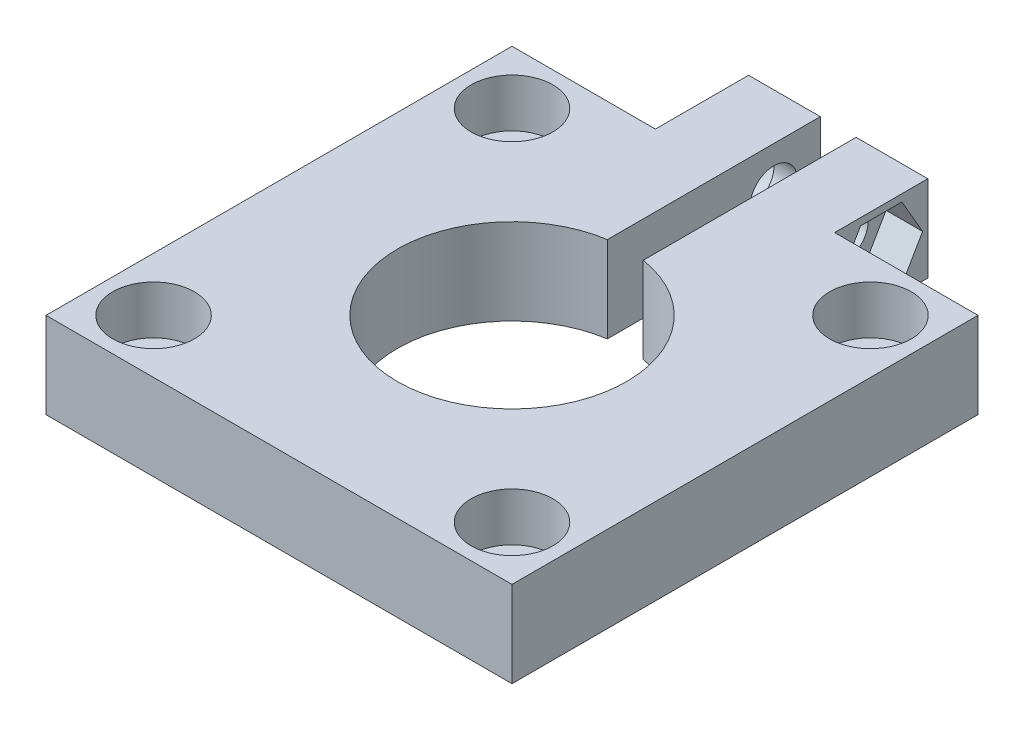
ISO-10303-21;
HEADER;
FILE_DESCRIPTION(('STEP AP214'),'2;1');
FILE_NAME('part.step','',(''),(''),'','','');
FILE_SCHEMA(('AUTOMOTIVE_DESIGN { 1 0 10303 214 1 1 1 1 }'));
ENDSEC;
DATA;
#1=APPLICATION_CONTEXT('core data for automotive mechanical design processes');
#2=APPLICATION_PROTOCOL_DEFINITION('international standard','automotive_design',2000,#1);
#3=PRODUCT_CONTEXT('',#1,'mechanical');
#4=PRODUCT('Part','Part','',(#3));
#5=PRODUCT_RELATED_PRODUCT_CATEGORY('part','',(#4));
#6=PRODUCT_DEFINITION_FORMATION('','',#4);
#7=PRODUCT_DEFINITION_CONTEXT('part definition',#1,'design');
#8=PRODUCT_DEFINITION('design','',#6,#7);
#9=PRODUCT_DEFINITION_SHAPE('','',#8);
#10=(LENGTH_UNIT() NAMED_UNIT(*) SI_UNIT(.MILLI.,.METRE.));
#11=(NAMED_UNIT(*) PLANE_ANGLE_UNIT() SI_UNIT($,.RADIAN.));
#12=(NAMED_UNIT(*) SI_UNIT($,.STERADIAN.) SOLID_ANGLE_UNIT());
#13=UNCERTAINTY_MEASURE_WITH_UNIT(LENGTH_MEASURE(1.E-05),#10,'distance_accuracy_value','');
#14=(GEOMETRIC_REPRESENTATION_CONTEXT(3) GLOBAL_UNCERTAINTY_ASSIGNED_CONTEXT((#13)) GLOBAL_UNIT_ASSIGNED_CONTEXT((#10,
#11,#12)) REPRESENTATION_CONTEXT('',''));
#15=CARTESIAN_POINT('',(0.,0.,0.));
#16=DIRECTION('',(0.,0.,1.));
#17=DIRECTION('',(1.,0.,0.));
#18=AXIS2_PLACEMENT_3D('',#15,#16,#17);
#19=CARTESIAN_POINT('',(-12.5,6.,-39.));
#20=DIRECTION('',(-1.,0.,0.));
#21=DIRECTION('',(0.,0.,1.));
#22=AXIS2_PLACEMENT_3D('',#19,#20,#21);
#23=CYLINDRICAL_SURFACE('',#22,3.3);
#24=CARTESIAN_POINT('',(2.5,6.,-39.));
#25=DIRECTION('',(1.,0.,0.));
#26=DIRECTION('',(0.,0.,-1.));
#27=AXIS2_PLACEMENT_3D('',#24,#25,#26);
#28=CIRCLE('',#27,3.3);
#29=CARTESIAN_POINT('',(2.5,6.,-42.3));
#30=VERTEX_POINT('',#29);
#31=EDGE_CURVE('E226',#30,#30,#28,.T.);
#32=ORIENTED_EDGE('',*,*,#31,.F.);
#33=EDGE_LOOP('',(#32));
#34=FACE_BOUND('',#33,.T.);
#35=CARTESIAN_POINT('',(7.4,6.,-39.));
#36=DIRECTION('',(1.,0.,0.));
#37=DIRECTION('',(0.,0.,-1.));
#38=AXIS2_PLACEMENT_3D('',#35,#36,#37);
#39=CIRCLE('',#38,3.3);
#40=CARTESIAN_POINT('',(7.4,6.,-42.3));
#41=VERTEX_POINT('',#40);
#42=EDGE_CURVE('E37',#41,#41,#39,.F.);
#43=ORIENTED_EDGE('',*,*,#42,.F.);
#44=EDGE_LOOP('',(#43));
#45=FACE_BOUND('',#44,.T.);
#46=ADVANCED_FACE('F33',(#34,#45),#23,.F.);
#47=CARTESIAN_POINT('',(-32.5,12.,-32.5));
#48=DIRECTION('',(0.,0.,1.));
#49=DIRECTION('',(1.,0.,0.));
#50=AXIS2_PLACEMENT_3D('',#47,#48,#49);
#51=PLANE('',#50);
#52=DIRECTION('',(-1.,0.,0.));
#53=VECTOR('',#52,1.);
#54=CARTESIAN_POINT('',(-32.5,0.,-32.5));
#55=LINE('',#54,#53);
#56=CARTESIAN_POINT('',(32.5,0.,-32.5));
#57=VERTEX_POINT('',#56);
#58=CARTESIAN_POINT('',(12.5,0.,-32.5));
#59=VERTEX_POINT('',#58);
#60=EDGE_CURVE('E301',#57,#59,#55,.T.);
#61=ORIENTED_EDGE('',*,*,#60,.T.);
#62=DIRECTION('',(0.,1.,0.));
#63=VECTOR('',#62,1.);
#64=CARTESIAN_POINT('',(12.5,0.,-32.5));
#65=LINE('',#64,#63);
#66=CARTESIAN_POINT('',(12.5,12.,-32.5));
#67=VERTEX_POINT('',#66);
#68=EDGE_CURVE('E57',#59,#67,#65,.T.);
#69=ORIENTED_EDGE('',*,*,#68,.T.);
#70=DIRECTION('',(-1.,0.,0.));
#71=VECTOR('',#70,1.);
#72=CARTESIAN_POINT('',(-32.5,12.,-32.5));
#73=LINE('',#72,#71);
#74=CARTESIAN_POINT('',(32.5,12.,-32.5));
#75=VERTEX_POINT('',#74);
#76=EDGE_CURVE('E291',#75,#67,#73,.T.);
#77=ORIENTED_EDGE('',*,*,#76,.F.);
#78=DIRECTION('',(0.,-1.,0.));
#79=VECTOR('',#78,1.);
#80=CARTESIAN_POINT('',(32.5,12.,-32.5));
#81=LINE('',#80,#79);
#82=EDGE_CURVE('E314',#75,#57,#81,.T.);
#83=ORIENTED_EDGE('',*,*,#82,.T.);
#84=EDGE_LOOP('',(#61,#69,#77,#83));
#85=FACE_BOUND('',#84,.T.);
#86=ADVANCED_FACE('F341',(#85),#51,.F.);
#87=CARTESIAN_POINT('',(32.5,12.,-32.5));
#88=DIRECTION('',(-1.,0.,0.));
#89=DIRECTION('',(0.,0.,1.));
#90=AXIS2_PLACEMENT_3D('',#87,#88,#89);
#91=PLANE('',#90);
#92=DIRECTION('',(0.,0.,-1.));
#93=VECTOR('',#92,1.);
#94=CARTESIAN_POINT('',(32.5,0.,-32.5));
#95=LINE('',#94,#93);
#96=CARTESIAN_POINT('',(32.5,0.,32.5));
#97=VERTEX_POINT('',#96);
#98=EDGE_CURVE('E283',#97,#57,#95,.T.);
#99=ORIENTED_EDGE('',*,*,#98,.T.);
#100=ORIENTED_EDGE('',*,*,#82,.F.);
#101=DIRECTION('',(0.,0.,-1.));
#102=VECTOR('',#101,1.);
#103=CARTESIAN_POINT('',(32.5,12.,-32.5));
#104=LINE('',#103,#102);
#105=CARTESIAN_POINT('',(32.5,12.,32.5));
#106=VERTEX_POINT('',#105);
#107=EDGE_CURVE('E286',#106,#75,#104,.T.);
#108=ORIENTED_EDGE('',*,*,#107,.F.);
#109=DIRECTION('',(0.,-1.,0.));
#110=VECTOR('',#109,1.);
#111=CARTESIAN_POINT('',(32.5,12.,32.5));
#112=LINE('',#111,#110);
#113=EDGE_CURVE('E297',#106,#97,#112,.T.);
#114=ORIENTED_EDGE('',*,*,#113,.T.);
#115=EDGE_LOOP('',(#99,#100,#108,#114));
#116=FACE_BOUND('',#115,.T.);
#117=ADVANCED_FACE('F35',(#116),#91,.F.);
#118=CARTESIAN_POINT('',(-12.5,12.,-32.5));
#119=VERTEX_POINT('',#118);
#120=CARTESIAN_POINT('',(-32.5,12.,-32.5));
#121=VERTEX_POINT('',#120);
#122=EDGE_CURVE('E289',#119,#121,#73,.T.);
#123=ORIENTED_EDGE('',*,*,#122,.F.);
#124=DIRECTION('',(0.,1.,0.));
#125=VECTOR('',#124,1.);
#126=CARTESIAN_POINT('',(-12.5,0.,-32.5));
#127=LINE('',#126,#125);
#128=CARTESIAN_POINT('',(-12.5,0.,-32.5));
#129=VERTEX_POINT('',#128);
#130=EDGE_CURVE('E263',#129,#119,#127,.T.);
#131=ORIENTED_EDGE('',*,*,#130,.F.);
#132=CARTESIAN_POINT('',(-32.5,0.,-32.5));
#133=VERTEX_POINT('',#132);
#134=EDGE_CURVE('E300',#129,#133,#55,.T.);
#135=ORIENTED_EDGE('',*,*,#134,.T.);
#136=DIRECTION('',(0.,-1.,0.));
#137=VECTOR('',#136,1.);
#138=CARTESIAN_POINT('',(-32.5,12.,-32.5));
#139=LINE('',#138,#137);
#140=EDGE_CURVE('E311',#121,#133,#139,.T.);
#141=ORIENTED_EDGE('',*,*,#140,.F.);
#142=EDGE_LOOP('',(#123,#131,#135,#141));
#143=FACE_BOUND('',#142,.T.);
#144=ADVANCED_FACE('F357',(#143),#51,.F.);
#145=CARTESIAN_POINT('',(-32.5,12.,-32.5));
#146=DIRECTION('',(1.,0.,0.));
#147=DIRECTION('',(0.,0.,-1.));
#148=AXIS2_PLACEMENT_3D('',#145,#146,#147);
#149=PLANE('',#148);
#150=DIRECTION('',(0.,0.,1.));
#151=VECTOR('',#150,1.);
#152=CARTESIAN_POINT('',(-32.5,0.,-32.5));
#153=LINE('',#152,#151);
#154=CARTESIAN_POINT('',(-32.5,0.,32.5));
#155=VERTEX_POINT('',#154);
#156=EDGE_CURVE('E303',#133,#155,#153,.T.);
#157=ORIENTED_EDGE('',*,*,#156,.T.);
#158=DIRECTION('',(0.,-1.,0.));
#159=VECTOR('',#158,1.);
#160=CARTESIAN_POINT('',(-32.5,12.,32.5));
#161=LINE('',#160,#159);
#162=CARTESIAN_POINT('',(-32.5,12.,32.5));
#163=VERTEX_POINT('',#162);
#164=EDGE_CURVE('E308',#163,#155,#161,.T.);
#165=ORIENTED_EDGE('',*,*,#164,.F.);
#166=DIRECTION('',(0.,0.,1.));
#167=VECTOR('',#166,1.);
#168=CARTESIAN_POINT('',(-32.5,12.,-32.5));
#169=LINE('',#168,#167);
#170=EDGE_CURVE('E293',#121,#163,#169,.T.);
#171=ORIENTED_EDGE('',*,*,#170,.F.);
#172=ORIENTED_EDGE('',*,*,#140,.T.);
#173=EDGE_LOOP('',(#157,#165,#171,#172));
#174=FACE_BOUND('',#173,.T.);
#175=ADVANCED_FACE('F354',(#174),#149,.F.);
#176=CARTESIAN_POINT('',(-32.5,12.,32.5));
#177=DIRECTION('',(0.,0.,-1.));
#178=DIRECTION('',(-1.,0.,0.));
#179=AXIS2_PLACEMENT_3D('',#176,#177,#178);
#180=PLANE('',#179);
#181=DIRECTION('',(1.,0.,0.));
#182=VECTOR('',#181,1.);
#183=CARTESIAN_POINT('',(-32.5,0.,32.5));
#184=LINE('',#183,#182);
#185=EDGE_CURVE('E290',#155,#97,#184,.T.);
#186=ORIENTED_EDGE('',*,*,#185,.T.);
#187=ORIENTED_EDGE('',*,*,#113,.F.);
#188=DIRECTION('',(1.,0.,0.));
#189=VECTOR('',#188,1.);
#190=CARTESIAN_POINT('',(-32.5,12.,32.5));
#191=LINE('',#190,#189);
#192=EDGE_CURVE('E295',#163,#106,#191,.T.);
#193=ORIENTED_EDGE('',*,*,#192,.F.);
#194=ORIENTED_EDGE('',*,*,#164,.T.);
#195=EDGE_LOOP('',(#186,#187,#193,#194));
#196=FACE_BOUND('',#195,.T.);
#197=ADVANCED_FACE('F349',(#196),#180,.F.);
#198=CARTESIAN_POINT('',(32.5,12.,32.5));
#199=DIRECTION('',(0.,1.,0.));
#200=DIRECTION('',(0.,0.,1.));
#201=AXIS2_PLACEMENT_3D('',#198,#199,#200);
#202=PLANE('',#201);
#203=CARTESIAN_POINT('',(-25.,12.,25.));
#204=DIRECTION('',(0.,1.,0.));
#205=DIRECTION('',(0.,0.,1.));
#206=AXIS2_PLACEMENT_3D('',#203,#204,#205);
#207=CIRCLE('',#206,5.7);
#208=CARTESIAN_POINT('',(-25.,12.,30.7));
#209=VERTEX_POINT('',#208);
#210=EDGE_CURVE('E511',#209,#209,#207,.T.);
#211=ORIENTED_EDGE('',*,*,#210,.F.);
#212=EDGE_LOOP('',(#211));
#213=FACE_BOUND('',#212,.T.);
#214=CARTESIAN_POINT('',(25.,12.,25.));
#215=DIRECTION('',(0.,1.,0.));
#216=DIRECTION('',(0.,0.,1.));
#217=AXIS2_PLACEMENT_3D('',#214,#215,#216);
#218=CIRCLE('',#217,5.7);
#219=CARTESIAN_POINT('',(25.,12.,30.7));
#220=VERTEX_POINT('',#219);
#221=EDGE_CURVE('E522',#220,#220,#218,.T.);
#222=ORIENTED_EDGE('',*,*,#221,.F.);
#223=EDGE_LOOP('',(#222));
#224=FACE_BOUND('',#223,.T.);
#225=CARTESIAN_POINT('',(25.,12.,-25.));
#226=DIRECTION('',(0.,1.,0.));
#227=DIRECTION('',(0.,0.,1.));
#228=AXIS2_PLACEMENT_3D('',#225,#226,#227);
#229=CIRCLE('',#228,5.7);
#230=CARTESIAN_POINT('',(25.,12.,-19.3));
#231=VERTEX_POINT('',#230);
#232=EDGE_CURVE('E534',#231,#231,#229,.T.);
#233=ORIENTED_EDGE('',*,*,#232,.F.);
#234=EDGE_LOOP('',(#233));
#235=FACE_BOUND('',#234,.T.);
#236=CARTESIAN_POINT('',(-25.,12.,-25.));
#237=DIRECTION('',(0.,1.,0.));
#238=DIRECTION('',(0.,0.,1.));
#239=AXIS2_PLACEMENT_3D('',#236,#237,#238);
#240=CIRCLE('',#239,5.7);
#241=CARTESIAN_POINT('',(-25.,12.,-19.3));
#242=VERTEX_POINT('',#241);
#243=EDGE_CURVE('E546',#242,#242,#240,.T.);
#244=ORIENTED_EDGE('',*,*,#243,.F.);
#245=EDGE_LOOP('',(#244));
#246=FACE_BOUND('',#245,.T.);
#247=DIRECTION('',(0.,0.,-1.));
#248=VECTOR('',#247,1.);
#249=CARTESIAN_POINT('',(2.5,12.,-52.5));
#250=LINE('',#249,#248);
#251=CARTESIAN_POINT('',(2.5,12.,-15.8034806292791));
#252=VERTEX_POINT('',#251);
#253=CARTESIAN_POINT('',(2.5,12.,-45.5));
#254=VERTEX_POINT('',#253);
#255=EDGE_CURVE('E266',#252,#254,#250,.T.);
#256=ORIENTED_EDGE('',*,*,#255,.F.);
#257=CARTESIAN_POINT('',(0.,12.,0.));
#258=DIRECTION('',(0.,1.,0.));
#259=DIRECTION('',(0.,0.,1.));
#260=AXIS2_PLACEMENT_3D('',#257,#258,#259);
#261=CIRCLE('',#260,16.);
#262=CARTESIAN_POINT('',(-2.5,12.,-15.8034806292791));
#263=VERTEX_POINT('',#262);
#264=EDGE_CURVE('E277',#263,#252,#261,.T.);
#265=ORIENTED_EDGE('',*,*,#264,.F.);
#266=DIRECTION('',(0.,0.,1.));
#267=VECTOR('',#266,1.);
#268=CARTESIAN_POINT('',(-2.5,12.,-52.5));
#269=LINE('',#268,#267);
#270=CARTESIAN_POINT('',(-2.5,12.,-45.5));
#271=VERTEX_POINT('',#270);
#272=EDGE_CURVE('E274',#271,#263,#269,.T.);
#273=ORIENTED_EDGE('',*,*,#272,.F.);
#274=DIRECTION('',(-1.,0.,0.));
#275=VECTOR('',#274,1.);
#276=CARTESIAN_POINT('',(-2.5,12.,-45.5));
#277=LINE('',#276,#275);
#278=CARTESIAN_POINT('',(-12.5,12.,-45.5));
#279=VERTEX_POINT('',#278);
#280=EDGE_CURVE('E246',#271,#279,#277,.T.);
#281=ORIENTED_EDGE('',*,*,#280,.T.);
#282=DIRECTION('',(0.,0.,1.));
#283=VECTOR('',#282,1.);
#284=CARTESIAN_POINT('',(-12.5,12.,-32.5));
#285=LINE('',#284,#283);
#286=EDGE_CURVE('E255',#279,#119,#285,.T.);
#287=ORIENTED_EDGE('',*,*,#286,.T.);
#288=ORIENTED_EDGE('',*,*,#122,.T.);
#289=ORIENTED_EDGE('',*,*,#170,.T.);
#290=ORIENTED_EDGE('',*,*,#192,.T.);
#291=ORIENTED_EDGE('',*,*,#107,.T.);
#292=ORIENTED_EDGE('',*,*,#76,.T.);
#293=DIRECTION('',(0.,0.,-1.));
#294=VECTOR('',#293,1.);
#295=CARTESIAN_POINT('',(12.5,12.,-32.5));
#296=LINE('',#295,#294);
#297=CARTESIAN_POINT('',(12.5,12.,-45.5));
#298=VERTEX_POINT('',#297);
#299=EDGE_CURVE('E232',#67,#298,#296,.T.);
#300=ORIENTED_EDGE('',*,*,#299,.T.);
#301=DIRECTION('',(-1.,0.,0.));
#302=VECTOR('',#301,1.);
#303=CARTESIAN_POINT('',(12.5,12.,-45.5));
#304=LINE('',#303,#302);
#305=EDGE_CURVE('E237',#298,#254,#304,.T.);
#306=ORIENTED_EDGE('',*,*,#305,.T.);
#307=EDGE_LOOP('',(#256,#265,#273,#281,#287,#288,#289,#290,#291,#292,#300,#306));
#308=FACE_BOUND('',#307,.T.);
#309=ADVANCED_FACE('F325',(#213,#224,#235,#246,#308),#202,.T.);
#310=CARTESIAN_POINT('',(32.5,0.,32.5));
#311=DIRECTION('',(0.,1.,0.));
#312=DIRECTION('',(0.,0.,1.));
#313=AXIS2_PLACEMENT_3D('',#310,#311,#312);
#314=PLANE('',#313);
#315=CARTESIAN_POINT('',(-25.,0.,25.));
#316=DIRECTION('',(0.,1.,0.));
#317=DIRECTION('',(0.,0.,1.));
#318=AXIS2_PLACEMENT_3D('',#315,#316,#317);
#319=CIRCLE('',#318,3.75);
#320=CARTESIAN_POINT('',(-25.,0.,28.75));
#321=VERTEX_POINT('',#320);
#322=EDGE_CURVE('E519',#321,#321,#319,.T.);
#323=ORIENTED_EDGE('',*,*,#322,.T.);
#324=EDGE_LOOP('',(#323));
#325=FACE_BOUND('',#324,.T.);
#326=CARTESIAN_POINT('',(25.,0.,25.));
#327=DIRECTION('',(0.,1.,0.));
#328=DIRECTION('',(0.,0.,1.));
#329=AXIS2_PLACEMENT_3D('',#326,#327,#328);
#330=CIRCLE('',#329,3.75);
#331=CARTESIAN_POINT('',(25.,0.,28.75));
#332=VERTEX_POINT('',#331);
#333=EDGE_CURVE('E531',#332,#332,#330,.T.);
#334=ORIENTED_EDGE('',*,*,#333,.T.);
#335=EDGE_LOOP('',(#334));
#336=FACE_BOUND('',#335,.T.);
#337=CARTESIAN_POINT('',(25.,0.,-25.));
#338=DIRECTION('',(0.,1.,0.));
#339=DIRECTION('',(0.,0.,1.));
#340=AXIS2_PLACEMENT_3D('',#337,#338,#339);
#341=CIRCLE('',#340,3.75);
#342=CARTESIAN_POINT('',(25.,0.,-21.25));
#343=VERTEX_POINT('',#342);
#344=EDGE_CURVE('E543',#343,#343,#341,.T.);
#345=ORIENTED_EDGE('',*,*,#344,.T.);
#346=EDGE_LOOP('',(#345));
#347=FACE_BOUND('',#346,.T.);
#348=CARTESIAN_POINT('',(-25.,0.,-25.));
#349=DIRECTION('',(0.,1.,0.));
#350=DIRECTION('',(0.,0.,1.));
#351=AXIS2_PLACEMENT_3D('',#348,#349,#350);
#352=CIRCLE('',#351,3.75);
#353=CARTESIAN_POINT('',(-25.,0.,-21.25));
#354=VERTEX_POINT('',#353);
#355=EDGE_CURVE('E187',#354,#354,#352,.T.);
#356=ORIENTED_EDGE('',*,*,#355,.T.);
#357=EDGE_LOOP('',(#356));
#358=FACE_BOUND('',#357,.T.);
#359=CARTESIAN_POINT('',(0.,0.,0.));
#360=DIRECTION('',(0.,1.,0.));
#361=DIRECTION('',(0.,0.,1.));
#362=AXIS2_PLACEMENT_3D('',#359,#360,#361);
#363=CIRCLE('',#362,16.);
#364=CARTESIAN_POINT('',(-2.5,0.,-15.8034806292791));
#365=VERTEX_POINT('',#364);
#366=CARTESIAN_POINT('',(2.5,0.,-15.8034806292791));
#367=VERTEX_POINT('',#366);
#368=EDGE_CURVE('E280',#365,#367,#363,.T.);
#369=ORIENTED_EDGE('',*,*,#368,.T.);
#370=DIRECTION('',(0.,0.,-1.));
#371=VECTOR('',#370,1.);
#372=CARTESIAN_POINT('',(2.5,0.,-52.5));
#373=LINE('',#372,#371);
#374=CARTESIAN_POINT('',(2.5,0.,-45.5));
#375=VERTEX_POINT('',#374);
#376=EDGE_CURVE('E271',#367,#375,#373,.T.);
#377=ORIENTED_EDGE('',*,*,#376,.T.);
#378=DIRECTION('',(-1.,0.,0.));
#379=VECTOR('',#378,1.);
#380=CARTESIAN_POINT('',(12.5,0.,-45.5));
#381=LINE('',#380,#379);
#382=CARTESIAN_POINT('',(12.5,0.,-45.5));
#383=VERTEX_POINT('',#382);
#384=EDGE_CURVE('E236',#383,#375,#381,.T.);
#385=ORIENTED_EDGE('',*,*,#384,.F.);
#386=DIRECTION('',(0.,0.,-1.));
#387=VECTOR('',#386,1.);
#388=CARTESIAN_POINT('',(12.5,0.,-32.5));
#389=LINE('',#388,#387);
#390=EDGE_CURVE('E233',#59,#383,#389,.T.);
#391=ORIENTED_EDGE('',*,*,#390,.F.);
#392=ORIENTED_EDGE('',*,*,#60,.F.);
#393=ORIENTED_EDGE('',*,*,#98,.F.);
#394=ORIENTED_EDGE('',*,*,#185,.F.);
#395=ORIENTED_EDGE('',*,*,#156,.F.);
#396=ORIENTED_EDGE('',*,*,#134,.F.);
#397=DIRECTION('',(0.,0.,1.));
#398=VECTOR('',#397,1.);
#399=CARTESIAN_POINT('',(-12.5,0.,-32.5));
#400=LINE('',#399,#398);
#401=CARTESIAN_POINT('',(-12.5,0.,-45.5));
#402=VERTEX_POINT('',#401);
#403=EDGE_CURVE('E254',#402,#129,#400,.T.);
#404=ORIENTED_EDGE('',*,*,#403,.F.);
#405=DIRECTION('',(-1.,0.,0.));
#406=VECTOR('',#405,1.);
#407=CARTESIAN_POINT('',(-2.5,0.,-45.5));
#408=LINE('',#407,#406);
#409=CARTESIAN_POINT('',(-2.5,0.,-45.5));
#410=VERTEX_POINT('',#409);
#411=EDGE_CURVE('E251',#410,#402,#408,.T.);
#412=ORIENTED_EDGE('',*,*,#411,.F.);
#413=DIRECTION('',(0.,0.,1.));
#414=VECTOR('',#413,1.);
#415=CARTESIAN_POINT('',(-2.5,0.,-52.5));
#416=LINE('',#415,#414);
#417=EDGE_CURVE('E273',#410,#365,#416,.T.);
#418=ORIENTED_EDGE('',*,*,#417,.T.);
#419=EDGE_LOOP('',(#369,#377,#385,#391,#392,#393,#394,#395,#396,#404,#412,#418));
#420=FACE_BOUND('',#419,.T.);
#421=ADVANCED_FACE('F335',(#325,#336,#347,#358,#420),#314,.F.);
#422=CARTESIAN_POINT('',(0.,0.,0.));
#423=DIRECTION('',(0.,1.,0.));
#424=DIRECTION('',(0.,0.,1.));
#425=AXIS2_PLACEMENT_3D('',#422,#423,#424);
#426=CYLINDRICAL_SURFACE('',#425,16.);
#427=ORIENTED_EDGE('',*,*,#264,.T.);
#428=DIRECTION('',(0.,1.,0.));
#429=VECTOR('',#428,1.);
#430=CARTESIAN_POINT('',(2.5,0.,-15.8034806292791));
#431=LINE('',#430,#429);
#432=EDGE_CURVE('E11',#252,#367,#431,.F.);
#433=ORIENTED_EDGE('',*,*,#432,.T.);
#434=ORIENTED_EDGE('',*,*,#368,.F.);
#435=DIRECTION('',(0.,1.,0.));
#436=VECTOR('',#435,1.);
#437=CARTESIAN_POINT('',(-2.5,0.,-15.8034806292791));
#438=LINE('',#437,#436);
#439=EDGE_CURVE('E42',#365,#263,#438,.T.);
#440=ORIENTED_EDGE('',*,*,#439,.T.);
#441=EDGE_LOOP('',(#427,#433,#434,#440));
#442=FACE_BOUND('',#441,.T.);
#443=ADVANCED_FACE('F321',(#442),#426,.F.);
#444=CARTESIAN_POINT('',(-2.5,0.,-52.5));
#445=DIRECTION('',(-1.,0.,0.));
#446=DIRECTION('',(0.,0.,1.));
#447=AXIS2_PLACEMENT_3D('',#444,#445,#446);
#448=PLANE('',#447);
#449=CARTESIAN_POINT('',(-2.5,6.,-39.));
#450=DIRECTION('',(-1.,0.,0.));
#451=DIRECTION('',(0.,0.,1.));
#452=AXIS2_PLACEMENT_3D('',#449,#450,#451);
#453=CIRCLE('',#452,3.3);
#454=CARTESIAN_POINT('',(-2.5,6.,-35.7));
#455=VERTEX_POINT('',#454);
#456=EDGE_CURVE('E229',#455,#455,#453,.T.);
#457=ORIENTED_EDGE('',*,*,#456,.T.);
#458=EDGE_LOOP('',(#457));
#459=FACE_BOUND('',#458,.T.);
#460=ORIENTED_EDGE('',*,*,#272,.T.);
#461=ORIENTED_EDGE('',*,*,#439,.F.);
#462=ORIENTED_EDGE('',*,*,#417,.F.);
#463=DIRECTION('',(0.,1.,0.));
#464=VECTOR('',#463,1.);
#465=CARTESIAN_POINT('',(-2.5,0.,-45.5));
#466=LINE('',#465,#464);
#467=EDGE_CURVE('E258',#410,#271,#466,.T.);
#468=ORIENTED_EDGE('',*,*,#467,.T.);
#469=EDGE_LOOP('',(#460,#461,#462,#468));
#470=FACE_BOUND('',#469,.T.);
#471=ADVANCED_FACE('F367',(#459,#470),#448,.F.);
#472=CARTESIAN_POINT('',(2.5,0.,-52.5));
#473=DIRECTION('',(1.,0.,0.));
#474=DIRECTION('',(0.,0.,-1.));
#475=AXIS2_PLACEMENT_3D('',#472,#473,#474);
#476=PLANE('',#475);
#477=ORIENTED_EDGE('',*,*,#31,.T.);
#478=EDGE_LOOP('',(#477));
#479=FACE_BOUND('',#478,.T.);
#480=ORIENTED_EDGE('',*,*,#376,.F.);
#481=ORIENTED_EDGE('',*,*,#432,.F.);
#482=ORIENTED_EDGE('',*,*,#255,.T.);
#483=DIRECTION('',(0.,1.,0.));
#484=VECTOR('',#483,1.);
#485=CARTESIAN_POINT('',(2.5,0.,-45.5));
#486=LINE('',#485,#484);
#487=EDGE_CURVE('E247',#375,#254,#486,.T.);
#488=ORIENTED_EDGE('',*,*,#487,.F.);
#489=EDGE_LOOP('',(#480,#481,#482,#488));
#490=FACE_BOUND('',#489,.T.);
#491=ADVANCED_FACE('F329',(#479,#490),#476,.F.);
#492=CARTESIAN_POINT('',(-12.5,0.,-32.5));
#493=DIRECTION('',(-1.,0.,0.));
#494=DIRECTION('',(0.,0.,1.));
#495=AXIS2_PLACEMENT_3D('',#492,#493,#494);
#496=PLANE('',#495);
#497=CARTESIAN_POINT('',(-12.5,6.,-39.));
#498=DIRECTION('',(-1.,0.,0.));
#499=DIRECTION('',(0.,0.,1.));
#500=AXIS2_PLACEMENT_3D('',#497,#498,#499);
#501=CIRCLE('',#500,5.25);
#502=CARTESIAN_POINT('',(-12.5,6.,-33.75));
#503=VERTEX_POINT('',#502);
#504=EDGE_CURVE('E217',#503,#503,#501,.T.);
#505=ORIENTED_EDGE('',*,*,#504,.F.);
#506=EDGE_LOOP('',(#505));
#507=FACE_BOUND('',#506,.T.);
#508=ORIENTED_EDGE('',*,*,#286,.F.);
#509=DIRECTION('',(0.,1.,0.));
#510=VECTOR('',#509,1.);
#511=CARTESIAN_POINT('',(-12.5,0.,-45.5));
#512=LINE('',#511,#510);
#513=EDGE_CURVE('E267',#402,#279,#512,.T.);
#514=ORIENTED_EDGE('',*,*,#513,.F.);
#515=ORIENTED_EDGE('',*,*,#403,.T.);
#516=ORIENTED_EDGE('',*,*,#130,.T.);
#517=EDGE_LOOP('',(#508,#514,#515,#516));
#518=FACE_BOUND('',#517,.T.);
#519=ADVANCED_FACE('F362',(#507,#518),#496,.T.);
#520=CARTESIAN_POINT('',(-2.5,0.,-45.5));
#521=DIRECTION('',(0.,0.,-1.));
#522=DIRECTION('',(-1.,0.,0.));
#523=AXIS2_PLACEMENT_3D('',#520,#521,#522);
#524=PLANE('',#523);
#525=ORIENTED_EDGE('',*,*,#280,.F.);
#526=ORIENTED_EDGE('',*,*,#467,.F.);
#527=ORIENTED_EDGE('',*,*,#411,.T.);
#528=ORIENTED_EDGE('',*,*,#513,.T.);
#529=EDGE_LOOP('',(#525,#526,#527,#528));
#530=FACE_BOUND('',#529,.T.);
#531=ADVANCED_FACE('F365',(#530),#524,.T.);
#532=CARTESIAN_POINT('',(12.5,0.,-32.5));
#533=DIRECTION('',(1.,0.,0.));
#534=DIRECTION('',(0.,0.,-1.));
#535=AXIS2_PLACEMENT_3D('',#532,#533,#534);
#536=PLANE('',#535);
#537=DIRECTION('',(0.,0.866025403784439,-0.5));
#538=VECTOR('',#537,1.);
#539=CARTESIAN_POINT('',(12.5,1.,-41.8867513459481));
#540=LINE('',#539,#538);
#541=CARTESIAN_POINT('',(12.5,1.,-41.8867513459481));
#542=VERTEX_POINT('',#541);
#543=CARTESIAN_POINT('',(12.5,6.,-44.7735026918963));
#544=VERTEX_POINT('',#543);
#545=EDGE_CURVE('E49',#542,#544,#540,.T.);
#546=ORIENTED_EDGE('',*,*,#545,.F.);
#547=DIRECTION('',(0.,0.,-1.));
#548=VECTOR('',#547,1.);
#549=CARTESIAN_POINT('',(12.5,1.,-36.1132486540519));
#550=LINE('',#549,#548);
#551=CARTESIAN_POINT('',(12.5,1.,-36.1132486540519));
#552=VERTEX_POINT('',#551);
#553=EDGE_CURVE('E181',#552,#542,#550,.T.);
#554=ORIENTED_EDGE('',*,*,#553,.F.);
#555=DIRECTION('',(0.,-0.866025403784439,-0.5));
#556=VECTOR('',#555,1.);
#557=CARTESIAN_POINT('',(12.5,6.,-33.2264973081037));
#558=LINE('',#557,#556);
#559=CARTESIAN_POINT('',(12.5,6.,-33.2264973081037));
#560=VERTEX_POINT('',#559);
#561=EDGE_CURVE('E184',#560,#552,#558,.T.);
#562=ORIENTED_EDGE('',*,*,#561,.F.);
#563=DIRECTION('',(0.,-0.866025403784439,0.5));
#564=VECTOR('',#563,1.);
#565=CARTESIAN_POINT('',(12.5,11.,-36.1132486540519));
#566=LINE('',#565,#564);
#567=CARTESIAN_POINT('',(12.5,11.,-36.1132486540519));
#568=VERTEX_POINT('',#567);
#569=EDGE_CURVE('E203',#568,#560,#566,.T.);
#570=ORIENTED_EDGE('',*,*,#569,.F.);
#571=DIRECTION('',(0.,0.,1.));
#572=VECTOR('',#571,1.);
#573=CARTESIAN_POINT('',(12.5,11.,-41.8867513459481));
#574=LINE('',#573,#572);
#575=CARTESIAN_POINT('',(12.5,11.,-41.8867513459481));
#576=VERTEX_POINT('',#575);
#577=EDGE_CURVE('E200',#576,#568,#574,.T.);
#578=ORIENTED_EDGE('',*,*,#577,.F.);
#579=DIRECTION('',(0.,0.866025403784439,0.5));
#580=VECTOR('',#579,1.);
#581=CARTESIAN_POINT('',(12.5,6.,-44.7735026918963));
#582=LINE('',#581,#580);
#583=EDGE_CURVE('E198',#544,#576,#582,.T.);
#584=ORIENTED_EDGE('',*,*,#583,.F.);
#585=EDGE_LOOP('',(#546,#554,#562,#570,#578,#584));
#586=FACE_BOUND('',#585,.T.);
#587=ORIENTED_EDGE('',*,*,#299,.F.);
#588=ORIENTED_EDGE('',*,*,#68,.F.);
#589=ORIENTED_EDGE('',*,*,#390,.T.);
#590=DIRECTION('',(0.,1.,0.));
#591=VECTOR('',#590,1.);
#592=CARTESIAN_POINT('',(12.5,0.,-45.5));
#593=LINE('',#592,#591);
#594=EDGE_CURVE('E240',#383,#298,#593,.T.);
#595=ORIENTED_EDGE('',*,*,#594,.T.);
#596=EDGE_LOOP('',(#587,#588,#589,#595));
#597=FACE_BOUND('',#596,.T.);
#598=ADVANCED_FACE('F338',(#586,#597),#536,.T.);
#599=CARTESIAN_POINT('',(12.5,0.,-45.5));
#600=DIRECTION('',(0.,0.,-1.));
#601=DIRECTION('',(-1.,0.,0.));
#602=AXIS2_PLACEMENT_3D('',#599,#600,#601);
#603=PLANE('',#602);
#604=ORIENTED_EDGE('',*,*,#305,.F.);
#605=ORIENTED_EDGE('',*,*,#594,.F.);
#606=ORIENTED_EDGE('',*,*,#384,.T.);
#607=ORIENTED_EDGE('',*,*,#487,.T.);
#608=EDGE_LOOP('',(#604,#605,#606,#607));
#609=FACE_BOUND('',#608,.T.);
#610=ADVANCED_FACE('F331',(#609),#603,.T.);
#611=CARTESIAN_POINT('',(-5.75,6.,-39.));
#612=DIRECTION('',(-1.,0.,0.));
#613=DIRECTION('',(0.,0.,1.));
#614=AXIS2_PLACEMENT_3D('',#611,#612,#613);
#615=CIRCLE('',#614,3.3);
#616=CARTESIAN_POINT('',(-5.75,6.,-35.7));
#617=VERTEX_POINT('',#616);
#618=EDGE_CURVE('E223',#617,#617,#615,.T.);
#619=ORIENTED_EDGE('',*,*,#618,.T.);
#620=EDGE_LOOP('',(#619));
#621=FACE_BOUND('',#620,.T.);
#622=ORIENTED_EDGE('',*,*,#456,.F.);
#623=EDGE_LOOP('',(#622));
#624=FACE_BOUND('',#623,.T.);
#625=ADVANCED_FACE('F382',(#621,#624),#23,.F.);
#626=CARTESIAN_POINT('',(-5.75,9.3,-39.));
#627=DIRECTION('',(1.,0.,0.));
#628=DIRECTION('',(0.,0.,-1.));
#629=AXIS2_PLACEMENT_3D('',#626,#627,#628);
#630=PLANE('',#629);
#631=ORIENTED_EDGE('',*,*,#618,.F.);
#632=EDGE_LOOP('',(#631));
#633=FACE_BOUND('',#632,.T.);
#634=CARTESIAN_POINT('',(-5.75,6.,-39.));
#635=DIRECTION('',(-1.,0.,0.));
#636=DIRECTION('',(0.,0.,1.));
#637=AXIS2_PLACEMENT_3D('',#634,#635,#636);
#638=CIRCLE('',#637,5.25);
#639=CARTESIAN_POINT('',(-5.75,6.,-33.75));
#640=VERTEX_POINT('',#639);
#641=EDGE_CURVE('E220',#640,#640,#638,.T.);
#642=ORIENTED_EDGE('',*,*,#641,.T.);
#643=EDGE_LOOP('',(#642));
#644=FACE_BOUND('',#643,.T.);
#645=ADVANCED_FACE('F391',(#633,#644),#630,.F.);
#646=CARTESIAN_POINT('',(-12.5,6.,-39.));
#647=DIRECTION('',(-1.,0.,0.));
#648=DIRECTION('',(0.,0.,1.));
#649=AXIS2_PLACEMENT_3D('',#646,#647,#648);
#650=CYLINDRICAL_SURFACE('',#649,5.25);
#651=ORIENTED_EDGE('',*,*,#641,.F.);
#652=EDGE_LOOP('',(#651));
#653=FACE_BOUND('',#652,.T.);
#654=ORIENTED_EDGE('',*,*,#504,.T.);
#655=EDGE_LOOP('',(#654));
#656=FACE_BOUND('',#655,.T.);
#657=ADVANCED_FACE('F397',(#653,#656),#650,.F.);
#658=CARTESIAN_POINT('',(7.4,6.,-44.7735026918963));
#659=DIRECTION('',(1.,0.,0.));
#660=DIRECTION('',(0.,0.,-1.));
#661=AXIS2_PLACEMENT_3D('',#658,#659,#660);
#662=PLANE('',#661);
#663=DIRECTION('',(0.,0.866025403784439,-0.5));
#664=VECTOR('',#663,1.);
#665=CARTESIAN_POINT('',(7.4,1.,-41.8867513459481));
#666=LINE('',#665,#664);
#667=CARTESIAN_POINT('',(7.4,1.,-41.8867513459481));
#668=VERTEX_POINT('',#667);
#669=CARTESIAN_POINT('',(7.4,6.,-44.7735026918963));
#670=VERTEX_POINT('',#669);
#671=EDGE_CURVE('E161',#668,#670,#666,.T.);
#672=ORIENTED_EDGE('',*,*,#671,.T.);
#673=DIRECTION('',(0.,0.866025403784439,0.5));
#674=VECTOR('',#673,1.);
#675=CARTESIAN_POINT('',(7.4,6.,-44.7735026918963));
#676=LINE('',#675,#674);
#677=CARTESIAN_POINT('',(7.4,11.,-41.8867513459481));
#678=VERTEX_POINT('',#677);
#679=EDGE_CURVE('E170',#670,#678,#676,.T.);
#680=ORIENTED_EDGE('',*,*,#679,.T.);
#681=DIRECTION('',(0.,0.,1.));
#682=VECTOR('',#681,1.);
#683=CARTESIAN_POINT('',(7.4,11.,-41.8867513459481));
#684=LINE('',#683,#682);
#685=CARTESIAN_POINT('',(7.4,11.,-36.1132486540519));
#686=VERTEX_POINT('',#685);
#687=EDGE_CURVE('E175',#678,#686,#684,.T.);
#688=ORIENTED_EDGE('',*,*,#687,.T.);
#689=DIRECTION('',(0.,-0.866025403784439,0.5));
#690=VECTOR('',#689,1.);
#691=CARTESIAN_POINT('',(7.4,11.,-36.1132486540519));
#692=LINE('',#691,#690);
#693=CARTESIAN_POINT('',(7.4,6.,-33.2264973081037));
#694=VERTEX_POINT('',#693);
#695=EDGE_CURVE('E191',#686,#694,#692,.T.);
#696=ORIENTED_EDGE('',*,*,#695,.T.);
#697=DIRECTION('',(0.,-0.866025403784439,-0.5));
#698=VECTOR('',#697,1.);
#699=CARTESIAN_POINT('',(7.4,6.,-33.2264973081037));
#700=LINE('',#699,#698);
#701=CARTESIAN_POINT('',(7.4,1.,-36.1132486540519));
#702=VERTEX_POINT('',#701);
#703=EDGE_CURVE('E194',#694,#702,#700,.T.);
#704=ORIENTED_EDGE('',*,*,#703,.T.);
#705=DIRECTION('',(0.,0.,-1.));
#706=VECTOR('',#705,1.);
#707=CARTESIAN_POINT('',(7.4,1.,-36.1132486540519));
#708=LINE('',#707,#706);
#709=EDGE_CURVE('E167',#702,#668,#708,.T.);
#710=ORIENTED_EDGE('',*,*,#709,.T.);
#711=EDGE_LOOP('',(#672,#680,#688,#696,#704,#710));
#712=FACE_BOUND('',#711,.T.);
#713=ORIENTED_EDGE('',*,*,#42,.T.);
#714=EDGE_LOOP('',(#713));
#715=FACE_BOUND('',#714,.T.);
#716=ADVANCED_FACE('F177',(#712,#715),#662,.T.);
#717=CARTESIAN_POINT('',(7.4,1.,-41.8867513459481));
#718=DIRECTION('',(0.,-0.5,-0.866025403784439));
#719=DIRECTION('',(0.,0.866025403784439,-0.5));
#720=AXIS2_PLACEMENT_3D('',#717,#718,#719);
#721=PLANE('',#720);
#722=ORIENTED_EDGE('',*,*,#545,.T.);
#723=DIRECTION('',(1.,0.,0.));
#724=VECTOR('',#723,1.);
#725=CARTESIAN_POINT('',(7.4,6.,-44.7735026918963));
#726=LINE('',#725,#724);
#727=EDGE_CURVE('E157',#670,#544,#726,.T.);
#728=ORIENTED_EDGE('',*,*,#727,.F.);
#729=ORIENTED_EDGE('',*,*,#671,.F.);
#730=DIRECTION('',(1.,0.,0.));
#731=VECTOR('',#730,1.);
#732=CARTESIAN_POINT('',(7.4,1.,-41.8867513459481));
#733=LINE('',#732,#731);
#734=EDGE_CURVE('E208',#668,#542,#733,.T.);
#735=ORIENTED_EDGE('',*,*,#734,.T.);
#736=EDGE_LOOP('',(#722,#728,#729,#735));
#737=FACE_BOUND('',#736,.T.);
#738=ADVANCED_FACE('F159',(#737),#721,.F.);
#739=CARTESIAN_POINT('',(7.4,1.,-36.1132486540519));
#740=DIRECTION('',(0.,-1.,0.));
#741=DIRECTION('',(0.,0.,-1.));
#742=AXIS2_PLACEMENT_3D('',#739,#740,#741);
#743=PLANE('',#742);
#744=ORIENTED_EDGE('',*,*,#553,.T.);
#745=ORIENTED_EDGE('',*,*,#734,.F.);
#746=ORIENTED_EDGE('',*,*,#709,.F.);
#747=DIRECTION('',(1.,0.,0.));
#748=VECTOR('',#747,1.);
#749=CARTESIAN_POINT('',(7.4,1.,-36.1132486540519));
#750=LINE('',#749,#748);
#751=EDGE_CURVE('E210',#702,#552,#750,.T.);
#752=ORIENTED_EDGE('',*,*,#751,.T.);
#753=EDGE_LOOP('',(#744,#745,#746,#752));
#754=FACE_BOUND('',#753,.T.);
#755=ADVANCED_FACE('F433',(#754),#743,.F.);
#756=CARTESIAN_POINT('',(7.4,6.,-33.2264973081037));
#757=DIRECTION('',(0.,-0.5,0.866025403784439));
#758=DIRECTION('',(0.,-0.866025403784439,-0.5));
#759=AXIS2_PLACEMENT_3D('',#756,#757,#758);
#760=PLANE('',#759);
#761=ORIENTED_EDGE('',*,*,#561,.T.);
#762=ORIENTED_EDGE('',*,*,#751,.F.);
#763=ORIENTED_EDGE('',*,*,#703,.F.);
#764=DIRECTION('',(1.,0.,0.));
#765=VECTOR('',#764,1.);
#766=CARTESIAN_POINT('',(7.4,6.,-33.2264973081037));
#767=LINE('',#766,#765);
#768=EDGE_CURVE('E212',#694,#560,#767,.T.);
#769=ORIENTED_EDGE('',*,*,#768,.T.);
#770=EDGE_LOOP('',(#761,#762,#763,#769));
#771=FACE_BOUND('',#770,.T.);
#772=ADVANCED_FACE('F431',(#771),#760,.F.);
#773=CARTESIAN_POINT('',(7.4,11.,-36.1132486540519));
#774=DIRECTION('',(0.,0.5,0.866025403784439));
#775=DIRECTION('',(0.,-0.866025403784439,0.5));
#776=AXIS2_PLACEMENT_3D('',#773,#774,#775);
#777=PLANE('',#776);
#778=ORIENTED_EDGE('',*,*,#569,.T.);
#779=ORIENTED_EDGE('',*,*,#768,.F.);
#780=ORIENTED_EDGE('',*,*,#695,.F.);
#781=DIRECTION('',(1.,0.,0.));
#782=VECTOR('',#781,1.);
#783=CARTESIAN_POINT('',(7.4,11.,-36.1132486540519));
#784=LINE('',#783,#782);
#785=EDGE_CURVE('E214',#686,#568,#784,.T.);
#786=ORIENTED_EDGE('',*,*,#785,.T.);
#787=EDGE_LOOP('',(#778,#779,#780,#786));
#788=FACE_BOUND('',#787,.T.);
#789=ADVANCED_FACE('F429',(#788),#777,.F.);
#790=CARTESIAN_POINT('',(7.4,11.,-41.8867513459481));
#791=DIRECTION('',(0.,1.,0.));
#792=DIRECTION('',(0.,0.,1.));
#793=AXIS2_PLACEMENT_3D('',#790,#791,#792);
#794=PLANE('',#793);
#795=ORIENTED_EDGE('',*,*,#577,.T.);
#796=ORIENTED_EDGE('',*,*,#785,.F.);
#797=ORIENTED_EDGE('',*,*,#687,.F.);
#798=DIRECTION('',(1.,0.,0.));
#799=VECTOR('',#798,1.);
#800=CARTESIAN_POINT('',(7.4,11.,-41.8867513459481));
#801=LINE('',#800,#799);
#802=EDGE_CURVE('E166',#678,#576,#801,.T.);
#803=ORIENTED_EDGE('',*,*,#802,.T.);
#804=EDGE_LOOP('',(#795,#796,#797,#803));
#805=FACE_BOUND('',#804,.T.);
#806=ADVANCED_FACE('F425',(#805),#794,.F.);
#807=CARTESIAN_POINT('',(7.4,6.,-44.7735026918963));
#808=DIRECTION('',(0.,0.5,-0.866025403784439));
#809=DIRECTION('',(0.,0.866025403784439,0.5));
#810=AXIS2_PLACEMENT_3D('',#807,#808,#809);
#811=PLANE('',#810);
#812=ORIENTED_EDGE('',*,*,#583,.T.);
#813=ORIENTED_EDGE('',*,*,#802,.F.);
#814=ORIENTED_EDGE('',*,*,#679,.F.);
#815=ORIENTED_EDGE('',*,*,#727,.T.);
#816=EDGE_LOOP('',(#812,#813,#814,#815));
#817=FACE_BOUND('',#816,.T.);
#818=ADVANCED_FACE('F171',(#817),#811,.F.);
#819=CARTESIAN_POINT('',(-25.,12.,-25.));
#820=DIRECTION('',(0.,1.,0.));
#821=DIRECTION('',(0.,0.,1.));
#822=AXIS2_PLACEMENT_3D('',#819,#820,#821);
#823=CYLINDRICAL_SURFACE('',#822,3.75);
#824=ORIENTED_EDGE('',*,*,#355,.F.);
#825=EDGE_LOOP('',(#824));
#826=FACE_BOUND('',#825,.T.);
#827=CARTESIAN_POINT('',(-25.,5.25,-25.));
#828=DIRECTION('',(0.,1.,0.));
#829=DIRECTION('',(0.,0.,1.));
#830=AXIS2_PLACEMENT_3D('',#827,#828,#829);
#831=CIRCLE('',#830,3.75);
#832=CARTESIAN_POINT('',(-25.,5.25,-21.25));
#833=VERTEX_POINT('',#832);
#834=EDGE_CURVE('E551',#833,#833,#831,.T.);
#835=ORIENTED_EDGE('',*,*,#834,.T.);
#836=EDGE_LOOP('',(#835));
#837=FACE_BOUND('',#836,.T.);
#838=ADVANCED_FACE('F450',(#826,#837),#823,.F.);
#839=CARTESIAN_POINT('',(-21.25,5.25,-25.));
#840=DIRECTION('',(0.,-1.,0.));
#841=DIRECTION('',(0.,0.,-1.));
#842=AXIS2_PLACEMENT_3D('',#839,#840,#841);
#843=PLANE('',#842);
#844=ORIENTED_EDGE('',*,*,#834,.F.);
#845=EDGE_LOOP('',(#844));
#846=FACE_BOUND('',#845,.T.);
#847=CARTESIAN_POINT('',(-25.,5.25,-25.));
#848=DIRECTION('',(0.,1.,0.));
#849=DIRECTION('',(0.,0.,1.));
#850=AXIS2_PLACEMENT_3D('',#847,#848,#849);
#851=CIRCLE('',#850,5.7);
#852=CARTESIAN_POINT('',(-25.,5.25,-19.3));
#853=VERTEX_POINT('',#852);
#854=EDGE_CURVE('E549',#853,#853,#851,.T.);
#855=ORIENTED_EDGE('',*,*,#854,.T.);
#856=EDGE_LOOP('',(#855));
#857=FACE_BOUND('',#856,.T.);
#858=ADVANCED_FACE('F454',(#846,#857),#843,.F.);
#859=CARTESIAN_POINT('',(-25.,12.,-25.));
#860=DIRECTION('',(0.,1.,0.));
#861=DIRECTION('',(0.,0.,1.));
#862=AXIS2_PLACEMENT_3D('',#859,#860,#861);
#863=CYLINDRICAL_SURFACE('',#862,5.7);
#864=ORIENTED_EDGE('',*,*,#854,.F.);
#865=EDGE_LOOP('',(#864));
#866=FACE_BOUND('',#865,.T.);
#867=ORIENTED_EDGE('',*,*,#243,.T.);
#868=EDGE_LOOP('',(#867));
#869=FACE_BOUND('',#868,.T.);
#870=ADVANCED_FACE('F459',(#866,#869),#863,.F.);
#871=CARTESIAN_POINT('',(25.,12.,-25.));
#872=DIRECTION('',(0.,1.,0.));
#873=DIRECTION('',(0.,0.,1.));
#874=AXIS2_PLACEMENT_3D('',#871,#872,#873);
#875=CYLINDRICAL_SURFACE('',#874,3.75000000000001);
#876=ORIENTED_EDGE('',*,*,#344,.F.);
#877=EDGE_LOOP('',(#876));
#878=FACE_BOUND('',#877,.T.);
#879=CARTESIAN_POINT('',(25.,5.25,-25.));
#880=DIRECTION('',(0.,1.,0.));
#881=DIRECTION('',(0.,0.,1.));
#882=AXIS2_PLACEMENT_3D('',#879,#880,#881);
#883=CIRCLE('',#882,3.75000000000001);
#884=CARTESIAN_POINT('',(25.,5.25,-21.25));
#885=VERTEX_POINT('',#884);
#886=EDGE_CURVE('E540',#885,#885,#883,.T.);
#887=ORIENTED_EDGE('',*,*,#886,.T.);
#888=EDGE_LOOP('',(#887));
#889=FACE_BOUND('',#888,.T.);
#890=ADVANCED_FACE('F467',(#878,#889),#875,.F.);
#891=CARTESIAN_POINT('',(28.75,5.25,-25.));
#892=DIRECTION('',(0.,-1.,0.));
#893=DIRECTION('',(0.,0.,-1.));
#894=AXIS2_PLACEMENT_3D('',#891,#892,#893);
#895=PLANE('',#894);
#896=ORIENTED_EDGE('',*,*,#886,.F.);
#897=EDGE_LOOP('',(#896));
#898=FACE_BOUND('',#897,.T.);
#899=CARTESIAN_POINT('',(25.,5.25,-25.));
#900=DIRECTION('',(0.,1.,0.));
#901=DIRECTION('',(0.,0.,1.));
#902=AXIS2_PLACEMENT_3D('',#899,#900,#901);
#903=CIRCLE('',#902,5.7);
#904=CARTESIAN_POINT('',(25.,5.25,-19.3));
#905=VERTEX_POINT('',#904);
#906=EDGE_CURVE('E537',#905,#905,#903,.T.);
#907=ORIENTED_EDGE('',*,*,#906,.T.);
#908=EDGE_LOOP('',(#907));
#909=FACE_BOUND('',#908,.T.);
#910=ADVANCED_FACE('F471',(#898,#909),#895,.F.);
#911=CARTESIAN_POINT('',(25.,12.,-25.));
#912=DIRECTION('',(0.,1.,0.));
#913=DIRECTION('',(0.,0.,1.));
#914=AXIS2_PLACEMENT_3D('',#911,#912,#913);
#915=CYLINDRICAL_SURFACE('',#914,5.7);
#916=ORIENTED_EDGE('',*,*,#906,.F.);
#917=EDGE_LOOP('',(#916));
#918=FACE_BOUND('',#917,.T.);
#919=ORIENTED_EDGE('',*,*,#232,.T.);
#920=EDGE_LOOP('',(#919));
#921=FACE_BOUND('',#920,.T.);
#922=ADVANCED_FACE('F475',(#918,#921),#915,.F.);
#923=CARTESIAN_POINT('',(25.,12.,25.));
#924=DIRECTION('',(0.,1.,0.));
#925=DIRECTION('',(0.,0.,1.));
#926=AXIS2_PLACEMENT_3D('',#923,#924,#925);
#927=CYLINDRICAL_SURFACE('',#926,3.75000000000001);
#928=ORIENTED_EDGE('',*,*,#333,.F.);
#929=EDGE_LOOP('',(#928));
#930=FACE_BOUND('',#929,.T.);
#931=CARTESIAN_POINT('',(25.,5.25,25.));
#932=DIRECTION('',(0.,1.,0.));
#933=DIRECTION('',(0.,0.,1.));
#934=AXIS2_PLACEMENT_3D('',#931,#932,#933);
#935=CIRCLE('',#934,3.75000000000001);
#936=CARTESIAN_POINT('',(25.,5.25,28.75));
#937=VERTEX_POINT('',#936);
#938=EDGE_CURVE('E528',#937,#937,#935,.T.);
#939=ORIENTED_EDGE('',*,*,#938,.T.);
#940=EDGE_LOOP('',(#939));
#941=FACE_BOUND('',#940,.T.);
#942=ADVANCED_FACE('F479',(#930,#941),#927,.F.);
#943=CARTESIAN_POINT('',(28.75,5.25,25.));
#944=DIRECTION('',(0.,-1.,0.));
#945=DIRECTION('',(0.,0.,-1.));
#946=AXIS2_PLACEMENT_3D('',#943,#944,#945);
#947=PLANE('',#946);
#948=ORIENTED_EDGE('',*,*,#938,.F.);
#949=EDGE_LOOP('',(#948));
#950=FACE_BOUND('',#949,.T.);
#951=CARTESIAN_POINT('',(25.,5.25,25.));
#952=DIRECTION('',(0.,1.,0.));
#953=DIRECTION('',(0.,0.,1.));
#954=AXIS2_PLACEMENT_3D('',#951,#952,#953);
#955=CIRCLE('',#954,5.7);
#956=CARTESIAN_POINT('',(25.,5.25,30.7));
#957=VERTEX_POINT('',#956);
#958=EDGE_CURVE('E525',#957,#957,#955,.T.);
#959=ORIENTED_EDGE('',*,*,#958,.T.);
#960=EDGE_LOOP('',(#959));
#961=FACE_BOUND('',#960,.T.);
#962=ADVANCED_FACE('F483',(#950,#961),#947,.F.);
#963=CARTESIAN_POINT('',(25.,12.,25.));
#964=DIRECTION('',(0.,1.,0.));
#965=DIRECTION('',(0.,0.,1.));
#966=AXIS2_PLACEMENT_3D('',#963,#964,#965);
#967=CYLINDRICAL_SURFACE('',#966,5.7);
#968=ORIENTED_EDGE('',*,*,#958,.F.);
#969=EDGE_LOOP('',(#968));
#970=FACE_BOUND('',#969,.T.);
#971=ORIENTED_EDGE('',*,*,#221,.T.);
#972=EDGE_LOOP('',(#971));
#973=FACE_BOUND('',#972,.T.);
#974=ADVANCED_FACE('F487',(#970,#973),#967,.F.);
#975=CARTESIAN_POINT('',(-25.,12.,25.));
#976=DIRECTION('',(0.,1.,0.));
#977=DIRECTION('',(0.,0.,1.));
#978=AXIS2_PLACEMENT_3D('',#975,#976,#977);
#979=CYLINDRICAL_SURFACE('',#978,3.75000000000001);
#980=ORIENTED_EDGE('',*,*,#322,.F.);
#981=EDGE_LOOP('',(#980));
#982=FACE_BOUND('',#981,.T.);
#983=CARTESIAN_POINT('',(-25.,5.25,25.));
#984=DIRECTION('',(0.,1.,0.));
#985=DIRECTION('',(0.,0.,1.));
#986=AXIS2_PLACEMENT_3D('',#983,#984,#985);
#987=CIRCLE('',#986,3.75000000000001);
#988=CARTESIAN_POINT('',(-25.,5.25,28.75));
#989=VERTEX_POINT('',#988);
#990=EDGE_CURVE('E514',#989,#989,#987,.T.);
#991=ORIENTED_EDGE('',*,*,#990,.T.);
#992=EDGE_LOOP('',(#991));
#993=FACE_BOUND('',#992,.T.);
#994=ADVANCED_FACE('F491',(#982,#993),#979,.F.);
#995=CARTESIAN_POINT('',(-21.25,5.25,25.));
#996=DIRECTION('',(0.,-1.,0.));
#997=DIRECTION('',(0.,0.,-1.));
#998=AXIS2_PLACEMENT_3D('',#995,#996,#997);
#999=PLANE('',#998);
#1000=ORIENTED_EDGE('',*,*,#990,.F.);
#1001=EDGE_LOOP('',(#1000));
#1002=FACE_BOUND('',#1001,.T.);
#1003=CARTESIAN_POINT('',(-25.,5.25,25.));
#1004=DIRECTION('',(0.,1.,0.));
#1005=DIRECTION('',(0.,0.,1.));
#1006=AXIS2_PLACEMENT_3D('',#1003,#1004,#1005);
#1007=CIRCLE('',#1006,5.7);
#1008=CARTESIAN_POINT('',(-25.,5.25,30.7));
#1009=VERTEX_POINT('',#1008);
#1010=EDGE_CURVE('E508',#1009,#1009,#1007,.T.);
#1011=ORIENTED_EDGE('',*,*,#1010,.T.);
#1012=EDGE_LOOP('',(#1011));
#1013=FACE_BOUND('',#1012,.T.);
#1014=ADVANCED_FACE('F495',(#1002,#1013),#999,.F.);
#1015=CARTESIAN_POINT('',(-25.,12.,25.));
#1016=DIRECTION('',(0.,1.,0.));
#1017=DIRECTION('',(0.,0.,1.));
#1018=AXIS2_PLACEMENT_3D('',#1015,#1016,#1017);
#1019=CYLINDRICAL_SURFACE('',#1018,5.7);
#1020=ORIENTED_EDGE('',*,*,#1010,.F.);
#1021=EDGE_LOOP('',(#1020));
#1022=FACE_BOUND('',#1021,.T.);
#1023=ORIENTED_EDGE('',*,*,#210,.T.);
#1024=EDGE_LOOP('',(#1023));
#1025=FACE_BOUND('',#1024,.T.);
#1026=ADVANCED_FACE('F499',(#1022,#1025),#1019,.F.);
#1027=CLOSED_SHELL('',(#46,#86,#117,#144,#175,#197,#309,#421,#443,#471,#491,#519,#531,#598,#610,
#625,#645,#657,#716,#738,#755,#772,#789,#806,#818,#838,#858,#870,#890,#910,#922,#942,#962,#974,
#994,#1014,#1026));
#1028=MANIFOLD_SOLID_BREP('B2',#1027);
#1029=ADVANCED_BREP_SHAPE_REPRESENTATION('',(#18,#1028),#14);
#1030=SHAPE_DEFINITION_REPRESENTATION(#9,#1029);
ENDSEC;
END-ISO-10303-21;
